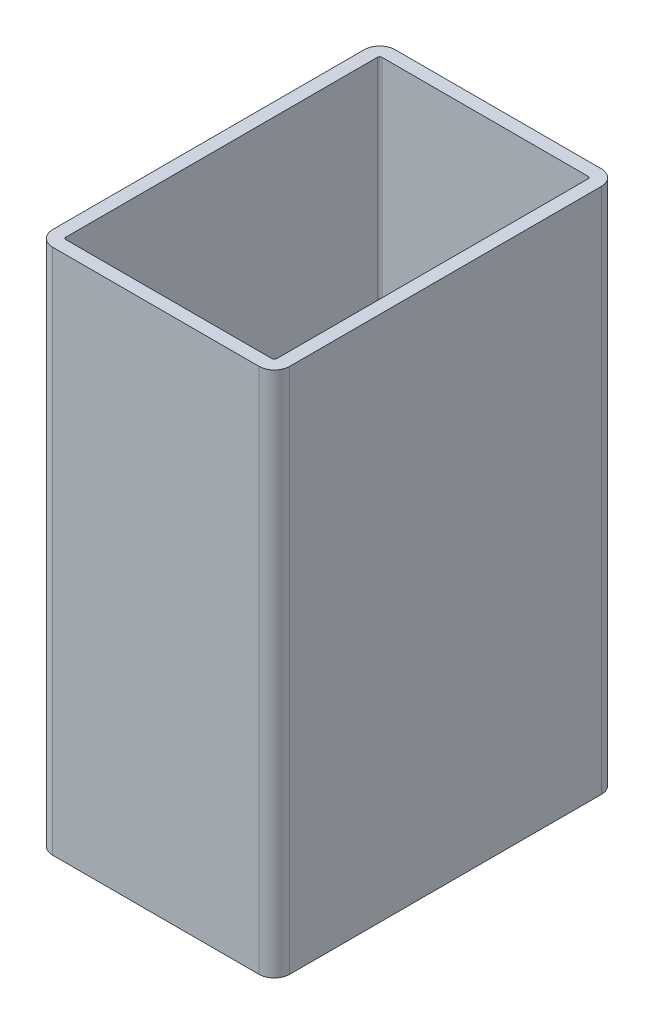
ISO-10303-21;
HEADER;
FILE_DESCRIPTION(('STEP AP214'),'2;1');
FILE_NAME('part.step','',(''),(''),'','','');
FILE_SCHEMA(('AUTOMOTIVE_DESIGN { 1 0 10303 214 1 1 1 1 }'));
ENDSEC;
DATA;
#1=APPLICATION_CONTEXT('core data for automotive mechanical design processes');
#2=APPLICATION_PROTOCOL_DEFINITION('international standard','automotive_design',2000,#1);
#3=PRODUCT_CONTEXT('',#1,'mechanical');
#4=PRODUCT('Part','Part','',(#3));
#5=PRODUCT_RELATED_PRODUCT_CATEGORY('part','',(#4));
#6=PRODUCT_DEFINITION_FORMATION('','',#4);
#7=PRODUCT_DEFINITION_CONTEXT('part definition',#1,'design');
#8=PRODUCT_DEFINITION('design','',#6,#7);
#9=PRODUCT_DEFINITION_SHAPE('','',#8);
#10=(LENGTH_UNIT() NAMED_UNIT(*) SI_UNIT(.MILLI.,.METRE.));
#11=(NAMED_UNIT(*) PLANE_ANGLE_UNIT() SI_UNIT($,.RADIAN.));
#12=(NAMED_UNIT(*) SI_UNIT($,.STERADIAN.) SOLID_ANGLE_UNIT());
#13=UNCERTAINTY_MEASURE_WITH_UNIT(LENGTH_MEASURE(1.E-05),#10,'distance_accuracy_value','');
#14=(GEOMETRIC_REPRESENTATION_CONTEXT(3) GLOBAL_UNCERTAINTY_ASSIGNED_CONTEXT((#13)) GLOBAL_UNIT_ASSIGNED_CONTEXT((#10,
#11,#12)) REPRESENTATION_CONTEXT('',''));
#15=CARTESIAN_POINT('',(0.,0.,0.));
#16=DIRECTION('',(0.,0.,1.));
#17=DIRECTION('',(1.,0.,0.));
#18=AXIS2_PLACEMENT_3D('',#15,#16,#17);
#19=CARTESIAN_POINT('',(-78.3333333333334,400.,118.333333333333));
#20=DIRECTION('',(0.,-1.,0.));
#21=DIRECTION('',(0.,0.,-1.));
#22=AXIS2_PLACEMENT_3D('',#19,#20,#21);
#23=CYLINDRICAL_SURFACE('',#22,11.6666666666667);
#24=CARTESIAN_POINT('',(-78.3333333333334,0.,118.333333333333));
#25=DIRECTION('',(0.,1.,0.));
#26=DIRECTION('',(0.,0.,1.));
#27=AXIS2_PLACEMENT_3D('',#24,#25,#26);
#28=CIRCLE('',#27,11.6666666666667);
#29=CARTESIAN_POINT('',(-90.,0.,118.333333333333));
#30=VERTEX_POINT('',#29);
#31=CARTESIAN_POINT('',(-78.3333333333333,0.,130.));
#32=VERTEX_POINT('',#31);
#33=EDGE_CURVE('E237',#30,#32,#28,.T.);
#34=ORIENTED_EDGE('',*,*,#33,.T.);
#35=DIRECTION('',(0.,-1.,0.));
#36=VECTOR('',#35,1.);
#37=CARTESIAN_POINT('',(-78.3333333333333,400.,130.));
#38=LINE('',#37,#36);
#39=CARTESIAN_POINT('',(-78.3333333333333,400.,130.));
#40=VERTEX_POINT('',#39);
#41=EDGE_CURVE('E12',#40,#32,#38,.T.);
#42=ORIENTED_EDGE('',*,*,#41,.F.);
#43=CARTESIAN_POINT('',(-78.3333333333334,400.,118.333333333333));
#44=DIRECTION('',(0.,1.,0.));
#45=DIRECTION('',(0.,0.,1.));
#46=AXIS2_PLACEMENT_3D('',#43,#44,#45);
#47=CIRCLE('',#46,11.6666666666667);
#48=CARTESIAN_POINT('',(-90.,400.,118.333333333333));
#49=VERTEX_POINT('',#48);
#50=EDGE_CURVE('E315',#49,#40,#47,.T.);
#51=ORIENTED_EDGE('',*,*,#50,.F.);
#52=DIRECTION('',(0.,-1.,0.));
#53=VECTOR('',#52,1.);
#54=CARTESIAN_POINT('',(-90.,400.,118.333333333333));
#55=LINE('',#54,#53);
#56=EDGE_CURVE('E252',#49,#30,#55,.T.);
#57=ORIENTED_EDGE('',*,*,#56,.T.);
#58=EDGE_LOOP('',(#34,#42,#51,#57));
#59=FACE_BOUND('',#58,.T.);
#60=ADVANCED_FACE('F65',(#59),#23,.T.);
#61=CARTESIAN_POINT('',(-78.3333333333333,400.,130.));
#62=DIRECTION('',(0.,0.,-1.));
#63=DIRECTION('',(-1.,0.,0.));
#64=AXIS2_PLACEMENT_3D('',#61,#62,#63);
#65=PLANE('',#64);
#66=DIRECTION('',(1.,0.,0.));
#67=VECTOR('',#66,1.);
#68=CARTESIAN_POINT('',(-78.3333333333333,0.,130.));
#69=LINE('',#68,#67);
#70=CARTESIAN_POINT('',(78.3333333333333,0.,130.));
#71=VERTEX_POINT('',#70);
#72=EDGE_CURVE('E240',#32,#71,#69,.T.);
#73=ORIENTED_EDGE('',*,*,#72,.T.);
#74=DIRECTION('',(0.,-1.,0.));
#75=VECTOR('',#74,1.);
#76=CARTESIAN_POINT('',(78.3333333333333,400.,130.));
#77=LINE('',#76,#75);
#78=CARTESIAN_POINT('',(78.3333333333333,400.,130.));
#79=VERTEX_POINT('',#78);
#80=EDGE_CURVE('E75',#79,#71,#77,.T.);
#81=ORIENTED_EDGE('',*,*,#80,.F.);
#82=DIRECTION('',(1.,0.,0.));
#83=VECTOR('',#82,1.);
#84=CARTESIAN_POINT('',(-78.3333333333333,400.,130.));
#85=LINE('',#84,#83);
#86=EDGE_CURVE('E317',#40,#79,#85,.T.);
#87=ORIENTED_EDGE('',*,*,#86,.F.);
#88=ORIENTED_EDGE('',*,*,#41,.T.);
#89=EDGE_LOOP('',(#73,#81,#87,#88));
#90=FACE_BOUND('',#89,.T.);
#91=ADVANCED_FACE('F352',(#90),#65,.F.);
#92=CARTESIAN_POINT('',(78.3333333333334,400.,118.333333333333));
#93=DIRECTION('',(0.,-1.,0.));
#94=DIRECTION('',(0.,0.,-1.));
#95=AXIS2_PLACEMENT_3D('',#92,#93,#94);
#96=CYLINDRICAL_SURFACE('',#95,11.6666666666667);
#97=CARTESIAN_POINT('',(78.3333333333334,0.,118.333333333333));
#98=DIRECTION('',(0.,1.,0.));
#99=DIRECTION('',(0.,0.,1.));
#100=AXIS2_PLACEMENT_3D('',#97,#98,#99);
#101=CIRCLE('',#100,11.6666666666667);
#102=CARTESIAN_POINT('',(90.,0.,118.333333333333));
#103=VERTEX_POINT('',#102);
#104=EDGE_CURVE('E242',#71,#103,#101,.T.);
#105=ORIENTED_EDGE('',*,*,#104,.T.);
#106=DIRECTION('',(0.,-1.,0.));
#107=VECTOR('',#106,1.);
#108=CARTESIAN_POINT('',(90.,400.,118.333333333333));
#109=LINE('',#108,#107);
#110=CARTESIAN_POINT('',(90.,400.,118.333333333333));
#111=VERTEX_POINT('',#110);
#112=EDGE_CURVE('E259',#111,#103,#109,.T.);
#113=ORIENTED_EDGE('',*,*,#112,.F.);
#114=CARTESIAN_POINT('',(78.3333333333334,400.,118.333333333333));
#115=DIRECTION('',(0.,1.,0.));
#116=DIRECTION('',(0.,0.,1.));
#117=AXIS2_PLACEMENT_3D('',#114,#115,#116);
#118=CIRCLE('',#117,11.6666666666667);
#119=EDGE_CURVE('E319',#79,#111,#118,.T.);
#120=ORIENTED_EDGE('',*,*,#119,.F.);
#121=ORIENTED_EDGE('',*,*,#80,.T.);
#122=EDGE_LOOP('',(#105,#113,#120,#121));
#123=FACE_BOUND('',#122,.T.);
#124=ADVANCED_FACE('F357',(#123),#96,.T.);
#125=CARTESIAN_POINT('',(90.,400.,-118.333333333333));
#126=DIRECTION('',(-1.,0.,0.));
#127=DIRECTION('',(0.,0.,1.));
#128=AXIS2_PLACEMENT_3D('',#125,#126,#127);
#129=PLANE('',#128);
#130=DIRECTION('',(0.,0.,-1.));
#131=VECTOR('',#130,1.);
#132=CARTESIAN_POINT('',(90.,0.,-118.333333333333));
#133=LINE('',#132,#131);
#134=CARTESIAN_POINT('',(90.,0.,-118.333333333333));
#135=VERTEX_POINT('',#134);
#136=EDGE_CURVE('E244',#103,#135,#133,.T.);
#137=ORIENTED_EDGE('',*,*,#136,.T.);
#138=DIRECTION('',(0.,-1.,0.));
#139=VECTOR('',#138,1.);
#140=CARTESIAN_POINT('',(90.,400.,-118.333333333333));
#141=LINE('',#140,#139);
#142=CARTESIAN_POINT('',(90.,400.,-118.333333333333));
#143=VERTEX_POINT('',#142);
#144=EDGE_CURVE('E256',#143,#135,#141,.T.);
#145=ORIENTED_EDGE('',*,*,#144,.F.);
#146=DIRECTION('',(0.,0.,-1.));
#147=VECTOR('',#146,1.);
#148=CARTESIAN_POINT('',(90.,400.,-118.333333333333));
#149=LINE('',#148,#147);
#150=EDGE_CURVE('E321',#111,#143,#149,.T.);
#151=ORIENTED_EDGE('',*,*,#150,.F.);
#152=ORIENTED_EDGE('',*,*,#112,.T.);
#153=EDGE_LOOP('',(#137,#145,#151,#152));
#154=FACE_BOUND('',#153,.T.);
#155=ADVANCED_FACE('F327',(#154),#129,.F.);
#156=CARTESIAN_POINT('',(78.3333333333333,400.,-118.333333333333));
#157=DIRECTION('',(0.,-1.,0.));
#158=DIRECTION('',(0.,0.,-1.));
#159=AXIS2_PLACEMENT_3D('',#156,#157,#158);
#160=CYLINDRICAL_SURFACE('',#159,11.6666666666667);
#161=CARTESIAN_POINT('',(78.3333333333333,0.,-118.333333333333));
#162=DIRECTION('',(0.,1.,0.));
#163=DIRECTION('',(0.,0.,1.));
#164=AXIS2_PLACEMENT_3D('',#161,#162,#163);
#165=CIRCLE('',#164,11.6666666666667);
#166=CARTESIAN_POINT('',(78.3333333333333,0.,-130.));
#167=VERTEX_POINT('',#166);
#168=EDGE_CURVE('E246',#135,#167,#165,.T.);
#169=ORIENTED_EDGE('',*,*,#168,.T.);
#170=DIRECTION('',(0.,-1.,0.));
#171=VECTOR('',#170,1.);
#172=CARTESIAN_POINT('',(78.3333333333333,400.,-130.));
#173=LINE('',#172,#171);
#174=CARTESIAN_POINT('',(78.3333333333333,400.,-130.));
#175=VERTEX_POINT('',#174);
#176=EDGE_CURVE('E204',#175,#167,#173,.T.);
#177=ORIENTED_EDGE('',*,*,#176,.F.);
#178=CARTESIAN_POINT('',(78.3333333333333,400.,-118.333333333333));
#179=DIRECTION('',(0.,1.,0.));
#180=DIRECTION('',(0.,0.,1.));
#181=AXIS2_PLACEMENT_3D('',#178,#179,#180);
#182=CIRCLE('',#181,11.6666666666667);
#183=EDGE_CURVE('E195',#143,#175,#182,.T.);
#184=ORIENTED_EDGE('',*,*,#183,.F.);
#185=ORIENTED_EDGE('',*,*,#144,.T.);
#186=EDGE_LOOP('',(#169,#177,#184,#185));
#187=FACE_BOUND('',#186,.T.);
#188=ADVANCED_FACE('F331',(#187),#160,.T.);
#189=CARTESIAN_POINT('',(78.3333333333333,400.,-130.));
#190=DIRECTION('',(0.,0.,1.));
#191=DIRECTION('',(1.,0.,0.));
#192=AXIS2_PLACEMENT_3D('',#189,#190,#191);
#193=PLANE('',#192);
#194=DIRECTION('',(-1.,0.,0.));
#195=VECTOR('',#194,1.);
#196=CARTESIAN_POINT('',(78.3333333333333,0.,-130.));
#197=LINE('',#196,#195);
#198=CARTESIAN_POINT('',(-78.3333333333333,0.,-130.));
#199=VERTEX_POINT('',#198);
#200=EDGE_CURVE('E203',#167,#199,#197,.T.);
#201=ORIENTED_EDGE('',*,*,#200,.T.);
#202=DIRECTION('',(0.,-1.,0.));
#203=VECTOR('',#202,1.);
#204=CARTESIAN_POINT('',(-78.3333333333333,400.,-130.));
#205=LINE('',#204,#203);
#206=CARTESIAN_POINT('',(-78.3333333333333,400.,-130.));
#207=VERTEX_POINT('',#206);
#208=EDGE_CURVE('E200',#207,#199,#205,.T.);
#209=ORIENTED_EDGE('',*,*,#208,.F.);
#210=DIRECTION('',(-1.,0.,0.));
#211=VECTOR('',#210,1.);
#212=CARTESIAN_POINT('',(78.3333333333333,400.,-130.));
#213=LINE('',#212,#211);
#214=EDGE_CURVE('E189',#175,#207,#213,.T.);
#215=ORIENTED_EDGE('',*,*,#214,.F.);
#216=ORIENTED_EDGE('',*,*,#176,.T.);
#217=EDGE_LOOP('',(#201,#209,#215,#216));
#218=FACE_BOUND('',#217,.T.);
#219=ADVANCED_FACE('F201',(#218),#193,.F.);
#220=CARTESIAN_POINT('',(-78.3333333333334,400.,-118.333333333333));
#221=DIRECTION('',(0.,-1.,0.));
#222=DIRECTION('',(0.,0.,-1.));
#223=AXIS2_PLACEMENT_3D('',#220,#221,#222);
#224=CYLINDRICAL_SURFACE('',#223,11.6666666666667);
#225=CARTESIAN_POINT('',(-78.3333333333334,0.,-118.333333333333));
#226=DIRECTION('',(0.,1.,0.));
#227=DIRECTION('',(0.,0.,1.));
#228=AXIS2_PLACEMENT_3D('',#225,#226,#227);
#229=CIRCLE('',#228,11.6666666666667);
#230=CARTESIAN_POINT('',(-90.,0.,-118.333333333333));
#231=VERTEX_POINT('',#230);
#232=EDGE_CURVE('E137',#199,#231,#229,.T.);
#233=ORIENTED_EDGE('',*,*,#232,.T.);
#234=DIRECTION('',(0.,-1.,0.));
#235=VECTOR('',#234,1.);
#236=CARTESIAN_POINT('',(-90.,400.,-118.333333333333));
#237=LINE('',#236,#235);
#238=CARTESIAN_POINT('',(-90.,400.,-118.333333333333));
#239=VERTEX_POINT('',#238);
#240=EDGE_CURVE('E205',#239,#231,#237,.T.);
#241=ORIENTED_EDGE('',*,*,#240,.F.);
#242=CARTESIAN_POINT('',(-78.3333333333334,400.,-118.333333333333));
#243=DIRECTION('',(0.,1.,0.));
#244=DIRECTION('',(0.,0.,1.));
#245=AXIS2_PLACEMENT_3D('',#242,#243,#244);
#246=CIRCLE('',#245,11.6666666666667);
#247=EDGE_CURVE('E193',#207,#239,#246,.T.);
#248=ORIENTED_EDGE('',*,*,#247,.F.);
#249=ORIENTED_EDGE('',*,*,#208,.T.);
#250=EDGE_LOOP('',(#233,#241,#248,#249));
#251=FACE_BOUND('',#250,.T.);
#252=ADVANCED_FACE('F207',(#251),#224,.T.);
#253=CARTESIAN_POINT('',(78.3333333333334,400.,118.333333333333));
#254=DIRECTION('',(0.,-1.,0.));
#255=DIRECTION('',(0.,0.,-1.));
#256=AXIS2_PLACEMENT_3D('',#253,#254,#255);
#257=CYLINDRICAL_SURFACE('',#256,1.66666666666671);
#258=CARTESIAN_POINT('',(78.3333333333334,0.,118.333333333333));
#259=DIRECTION('',(0.,1.,0.));
#260=DIRECTION('',(0.,0.,1.));
#261=AXIS2_PLACEMENT_3D('',#258,#259,#260);
#262=CIRCLE('',#261,1.66666666666671);
#263=CARTESIAN_POINT('',(78.3333333333333,0.,120.));
#264=VERTEX_POINT('',#263);
#265=CARTESIAN_POINT('',(80.,0.,118.333333333333));
#266=VERTEX_POINT('',#265);
#267=EDGE_CURVE('E213',#264,#266,#262,.T.);
#268=ORIENTED_EDGE('',*,*,#267,.F.);
#269=DIRECTION('',(0.,-1.,0.));
#270=VECTOR('',#269,1.);
#271=CARTESIAN_POINT('',(78.3333333333333,400.,120.));
#272=LINE('',#271,#270);
#273=CARTESIAN_POINT('',(78.3333333333333,400.,120.));
#274=VERTEX_POINT('',#273);
#275=EDGE_CURVE('E69',#274,#264,#272,.T.);
#276=ORIENTED_EDGE('',*,*,#275,.F.);
#277=CARTESIAN_POINT('',(78.3333333333334,400.,118.333333333333));
#278=DIRECTION('',(0.,1.,0.));
#279=DIRECTION('',(0.,0.,1.));
#280=AXIS2_PLACEMENT_3D('',#277,#278,#279);
#281=CIRCLE('',#280,1.66666666666671);
#282=CARTESIAN_POINT('',(80.,400.,118.333333333333));
#283=VERTEX_POINT('',#282);
#284=EDGE_CURVE('E251',#274,#283,#281,.T.);
#285=ORIENTED_EDGE('',*,*,#284,.T.);
#286=DIRECTION('',(0.,-1.,0.));
#287=VECTOR('',#286,1.);
#288=CARTESIAN_POINT('',(80.,400.,118.333333333333));
#289=LINE('',#288,#287);
#290=EDGE_CURVE('E209',#283,#266,#289,.T.);
#291=ORIENTED_EDGE('',*,*,#290,.T.);
#292=EDGE_LOOP('',(#268,#276,#285,#291));
#293=FACE_BOUND('',#292,.T.);
#294=ADVANCED_FACE('F67',(#293),#257,.F.);
#295=CARTESIAN_POINT('',(-78.3333333333333,400.,120.));
#296=DIRECTION('',(0.,0.,-1.));
#297=DIRECTION('',(-1.,0.,0.));
#298=AXIS2_PLACEMENT_3D('',#295,#296,#297);
#299=PLANE('',#298);
#300=DIRECTION('',(1.,0.,0.));
#301=VECTOR('',#300,1.);
#302=CARTESIAN_POINT('',(-78.3333333333333,0.,120.));
#303=LINE('',#302,#301);
#304=CARTESIAN_POINT('',(-78.3333333333333,0.,120.));
#305=VERTEX_POINT('',#304);
#306=EDGE_CURVE('E216',#305,#264,#303,.T.);
#307=ORIENTED_EDGE('',*,*,#306,.F.);
#308=DIRECTION('',(0.,-1.,0.));
#309=VECTOR('',#308,1.);
#310=CARTESIAN_POINT('',(-78.3333333333333,400.,120.));
#311=LINE('',#310,#309);
#312=CARTESIAN_POINT('',(-78.3333333333333,400.,120.));
#313=VERTEX_POINT('',#312);
#314=EDGE_CURVE('E274',#313,#305,#311,.T.);
#315=ORIENTED_EDGE('',*,*,#314,.F.);
#316=DIRECTION('',(1.,0.,0.));
#317=VECTOR('',#316,1.);
#318=CARTESIAN_POINT('',(-78.3333333333333,400.,120.));
#319=LINE('',#318,#317);
#320=EDGE_CURVE('E283',#313,#274,#319,.T.);
#321=ORIENTED_EDGE('',*,*,#320,.T.);
#322=ORIENTED_EDGE('',*,*,#275,.T.);
#323=EDGE_LOOP('',(#307,#315,#321,#322));
#324=FACE_BOUND('',#323,.T.);
#325=ADVANCED_FACE('F281',(#324),#299,.T.);
#326=CARTESIAN_POINT('',(-78.3333333333334,400.,118.333333333333));
#327=DIRECTION('',(0.,-1.,0.));
#328=DIRECTION('',(0.,0.,-1.));
#329=AXIS2_PLACEMENT_3D('',#326,#327,#328);
#330=CYLINDRICAL_SURFACE('',#329,1.66666666666671);
#331=CARTESIAN_POINT('',(-78.3333333333334,0.,118.333333333333));
#332=DIRECTION('',(0.,1.,0.));
#333=DIRECTION('',(0.,0.,1.));
#334=AXIS2_PLACEMENT_3D('',#331,#332,#333);
#335=CIRCLE('',#334,1.66666666666671);
#336=CARTESIAN_POINT('',(-80.0000000000001,0.,118.333333333333));
#337=VERTEX_POINT('',#336);
#338=EDGE_CURVE('E219',#337,#305,#335,.T.);
#339=ORIENTED_EDGE('',*,*,#338,.F.);
#340=DIRECTION('',(0.,-1.,0.));
#341=VECTOR('',#340,1.);
#342=CARTESIAN_POINT('',(-80.0000000000001,400.,118.333333333333));
#343=LINE('',#342,#341);
#344=CARTESIAN_POINT('',(-80.0000000000001,400.,118.333333333333));
#345=VERTEX_POINT('',#344);
#346=EDGE_CURVE('E273',#345,#337,#343,.T.);
#347=ORIENTED_EDGE('',*,*,#346,.F.);
#348=CARTESIAN_POINT('',(-78.3333333333334,400.,118.333333333333));
#349=DIRECTION('',(0.,1.,0.));
#350=DIRECTION('',(0.,0.,1.));
#351=AXIS2_PLACEMENT_3D('',#348,#349,#350);
#352=CIRCLE('',#351,1.66666666666671);
#353=EDGE_CURVE('E291',#345,#313,#352,.T.);
#354=ORIENTED_EDGE('',*,*,#353,.T.);
#355=ORIENTED_EDGE('',*,*,#314,.T.);
#356=EDGE_LOOP('',(#339,#347,#354,#355));
#357=FACE_BOUND('',#356,.T.);
#358=ADVANCED_FACE('F289',(#357),#330,.F.);
#359=CARTESIAN_POINT('',(-80.,400.,118.333333333333));
#360=DIRECTION('',(1.,0.,0.));
#361=DIRECTION('',(0.,0.,-1.));
#362=AXIS2_PLACEMENT_3D('',#359,#360,#361);
#363=PLANE('',#362);
#364=DIRECTION('',(0.,0.,1.));
#365=VECTOR('',#364,1.);
#366=CARTESIAN_POINT('',(-80.,0.,118.333333333333));
#367=LINE('',#366,#365);
#368=CARTESIAN_POINT('',(-80.,0.,-118.333333333333));
#369=VERTEX_POINT('',#368);
#370=EDGE_CURVE('E222',#369,#337,#367,.T.);
#371=ORIENTED_EDGE('',*,*,#370,.F.);
#372=DIRECTION('',(0.,-1.,0.));
#373=VECTOR('',#372,1.);
#374=CARTESIAN_POINT('',(-80.,400.,-118.333333333333));
#375=LINE('',#374,#373);
#376=CARTESIAN_POINT('',(-80.,400.,-118.333333333333));
#377=VERTEX_POINT('',#376);
#378=EDGE_CURVE('E271',#377,#369,#375,.T.);
#379=ORIENTED_EDGE('',*,*,#378,.F.);
#380=DIRECTION('',(0.,0.,1.));
#381=VECTOR('',#380,1.);
#382=CARTESIAN_POINT('',(-80.,400.,118.333333333333));
#383=LINE('',#382,#381);
#384=EDGE_CURVE('E297',#377,#345,#383,.T.);
#385=ORIENTED_EDGE('',*,*,#384,.T.);
#386=ORIENTED_EDGE('',*,*,#346,.T.);
#387=EDGE_LOOP('',(#371,#379,#385,#386));
#388=FACE_BOUND('',#387,.T.);
#389=ADVANCED_FACE('F300',(#388),#363,.T.);
#390=CARTESIAN_POINT('',(-78.3333333333334,400.,-118.333333333333));
#391=DIRECTION('',(0.,-1.,0.));
#392=DIRECTION('',(0.,0.,-1.));
#393=AXIS2_PLACEMENT_3D('',#390,#391,#392);
#394=CYLINDRICAL_SURFACE('',#393,1.66666666666671);
#395=CARTESIAN_POINT('',(-78.3333333333334,0.,-118.333333333333));
#396=DIRECTION('',(0.,1.,0.));
#397=DIRECTION('',(0.,0.,1.));
#398=AXIS2_PLACEMENT_3D('',#395,#396,#397);
#399=CIRCLE('',#398,1.66666666666671);
#400=CARTESIAN_POINT('',(-78.3333333333333,0.,-120.));
#401=VERTEX_POINT('',#400);
#402=EDGE_CURVE('E225',#401,#369,#399,.T.);
#403=ORIENTED_EDGE('',*,*,#402,.F.);
#404=DIRECTION('',(0.,-1.,0.));
#405=VECTOR('',#404,1.);
#406=CARTESIAN_POINT('',(-78.3333333333333,400.,-120.));
#407=LINE('',#406,#405);
#408=CARTESIAN_POINT('',(-78.3333333333333,400.,-120.));
#409=VERTEX_POINT('',#408);
#410=EDGE_CURVE('E269',#409,#401,#407,.T.);
#411=ORIENTED_EDGE('',*,*,#410,.F.);
#412=CARTESIAN_POINT('',(-78.3333333333334,400.,-118.333333333333));
#413=DIRECTION('',(0.,1.,0.));
#414=DIRECTION('',(0.,0.,1.));
#415=AXIS2_PLACEMENT_3D('',#412,#413,#414);
#416=CIRCLE('',#415,1.66666666666671);
#417=EDGE_CURVE('E301',#409,#377,#416,.T.);
#418=ORIENTED_EDGE('',*,*,#417,.T.);
#419=ORIENTED_EDGE('',*,*,#378,.T.);
#420=EDGE_LOOP('',(#403,#411,#418,#419));
#421=FACE_BOUND('',#420,.T.);
#422=ADVANCED_FACE('F368',(#421),#394,.F.);
#423=CARTESIAN_POINT('',(78.3333333333333,400.,-120.));
#424=DIRECTION('',(0.,0.,1.));
#425=DIRECTION('',(1.,0.,0.));
#426=AXIS2_PLACEMENT_3D('',#423,#424,#425);
#427=PLANE('',#426);
#428=DIRECTION('',(-1.,0.,0.));
#429=VECTOR('',#428,1.);
#430=CARTESIAN_POINT('',(78.3333333333333,0.,-120.));
#431=LINE('',#430,#429);
#432=CARTESIAN_POINT('',(78.3333333333333,0.,-120.));
#433=VERTEX_POINT('',#432);
#434=EDGE_CURVE('E228',#433,#401,#431,.T.);
#435=ORIENTED_EDGE('',*,*,#434,.F.);
#436=DIRECTION('',(0.,-1.,0.));
#437=VECTOR('',#436,1.);
#438=CARTESIAN_POINT('',(78.3333333333333,400.,-120.));
#439=LINE('',#438,#437);
#440=CARTESIAN_POINT('',(78.3333333333333,400.,-120.));
#441=VERTEX_POINT('',#440);
#442=EDGE_CURVE('E267',#441,#433,#439,.T.);
#443=ORIENTED_EDGE('',*,*,#442,.F.);
#444=DIRECTION('',(-1.,0.,0.));
#445=VECTOR('',#444,1.);
#446=CARTESIAN_POINT('',(78.3333333333333,400.,-120.));
#447=LINE('',#446,#445);
#448=EDGE_CURVE('E303',#441,#409,#447,.T.);
#449=ORIENTED_EDGE('',*,*,#448,.T.);
#450=ORIENTED_EDGE('',*,*,#410,.T.);
#451=EDGE_LOOP('',(#435,#443,#449,#450));
#452=FACE_BOUND('',#451,.T.);
#453=ADVANCED_FACE('F364',(#452),#427,.T.);
#454=CARTESIAN_POINT('',(78.3333333333333,400.,-118.333333333333));
#455=DIRECTION('',(0.,-1.,0.));
#456=DIRECTION('',(0.,0.,-1.));
#457=AXIS2_PLACEMENT_3D('',#454,#455,#456);
#458=CYLINDRICAL_SURFACE('',#457,1.66666666666669);
#459=CARTESIAN_POINT('',(78.3333333333333,0.,-118.333333333333));
#460=DIRECTION('',(0.,1.,0.));
#461=DIRECTION('',(0.,0.,1.));
#462=AXIS2_PLACEMENT_3D('',#459,#460,#461);
#463=CIRCLE('',#462,1.66666666666669);
#464=CARTESIAN_POINT('',(80.,0.,-118.333333333333));
#465=VERTEX_POINT('',#464);
#466=EDGE_CURVE('E231',#465,#433,#463,.T.);
#467=ORIENTED_EDGE('',*,*,#466,.F.);
#468=DIRECTION('',(0.,-1.,0.));
#469=VECTOR('',#468,1.);
#470=CARTESIAN_POINT('',(80.,400.,-118.333333333333));
#471=LINE('',#470,#469);
#472=CARTESIAN_POINT('',(80.,400.,-118.333333333333));
#473=VERTEX_POINT('',#472);
#474=EDGE_CURVE('E265',#473,#465,#471,.T.);
#475=ORIENTED_EDGE('',*,*,#474,.F.);
#476=CARTESIAN_POINT('',(78.3333333333333,400.,-118.333333333333));
#477=DIRECTION('',(0.,1.,0.));
#478=DIRECTION('',(0.,0.,1.));
#479=AXIS2_PLACEMENT_3D('',#476,#477,#478);
#480=CIRCLE('',#479,1.66666666666669);
#481=EDGE_CURVE('E309',#473,#441,#480,.T.);
#482=ORIENTED_EDGE('',*,*,#481,.T.);
#483=ORIENTED_EDGE('',*,*,#442,.T.);
#484=EDGE_LOOP('',(#467,#475,#482,#483));
#485=FACE_BOUND('',#484,.T.);
#486=ADVANCED_FACE('F346',(#485),#458,.F.);
#487=CARTESIAN_POINT('',(80.,400.,-118.333333333333));
#488=DIRECTION('',(-1.,0.,0.));
#489=DIRECTION('',(0.,0.,1.));
#490=AXIS2_PLACEMENT_3D('',#487,#488,#489);
#491=PLANE('',#490);
#492=DIRECTION('',(0.,0.,-1.));
#493=VECTOR('',#492,1.);
#494=CARTESIAN_POINT('',(80.,0.,-118.333333333333));
#495=LINE('',#494,#493);
#496=EDGE_CURVE('E234',#266,#465,#495,.T.);
#497=ORIENTED_EDGE('',*,*,#496,.F.);
#498=ORIENTED_EDGE('',*,*,#290,.F.);
#499=DIRECTION('',(0.,0.,-1.));
#500=VECTOR('',#499,1.);
#501=CARTESIAN_POINT('',(80.,400.,-118.333333333333));
#502=LINE('',#501,#500);
#503=EDGE_CURVE('E312',#283,#473,#502,.T.);
#504=ORIENTED_EDGE('',*,*,#503,.T.);
#505=ORIENTED_EDGE('',*,*,#474,.T.);
#506=EDGE_LOOP('',(#497,#498,#504,#505));
#507=FACE_BOUND('',#506,.T.);
#508=ADVANCED_FACE('F339',(#507),#491,.T.);
#509=CARTESIAN_POINT('',(-90.,400.,118.333333333333));
#510=DIRECTION('',(1.,0.,0.));
#511=DIRECTION('',(0.,0.,-1.));
#512=AXIS2_PLACEMENT_3D('',#509,#510,#511);
#513=PLANE('',#512);
#514=DIRECTION('',(0.,0.,1.));
#515=VECTOR('',#514,1.);
#516=CARTESIAN_POINT('',(-90.,0.,118.333333333333));
#517=LINE('',#516,#515);
#518=EDGE_CURVE('E143',#231,#30,#517,.T.);
#519=ORIENTED_EDGE('',*,*,#518,.T.);
#520=ORIENTED_EDGE('',*,*,#56,.F.);
#521=DIRECTION('',(0.,0.,1.));
#522=VECTOR('',#521,1.);
#523=CARTESIAN_POINT('',(-90.,400.,118.333333333333));
#524=LINE('',#523,#522);
#525=EDGE_CURVE('E84',#239,#49,#524,.T.);
#526=ORIENTED_EDGE('',*,*,#525,.F.);
#527=ORIENTED_EDGE('',*,*,#240,.T.);
#528=EDGE_LOOP('',(#519,#520,#526,#527));
#529=FACE_BOUND('',#528,.T.);
#530=ADVANCED_FACE('F337',(#529),#513,.F.);
#531=CARTESIAN_POINT('',(-78.3333333333334,400.,118.333333333333));
#532=DIRECTION('',(0.,1.,0.));
#533=DIRECTION('',(0.,0.,1.));
#534=AXIS2_PLACEMENT_3D('',#531,#532,#533);
#535=PLANE('',#534);
#536=ORIENTED_EDGE('',*,*,#284,.F.);
#537=ORIENTED_EDGE('',*,*,#320,.F.);
#538=ORIENTED_EDGE('',*,*,#353,.F.);
#539=ORIENTED_EDGE('',*,*,#384,.F.);
#540=ORIENTED_EDGE('',*,*,#417,.F.);
#541=ORIENTED_EDGE('',*,*,#448,.F.);
#542=ORIENTED_EDGE('',*,*,#481,.F.);
#543=ORIENTED_EDGE('',*,*,#503,.F.);
#544=EDGE_LOOP('',(#536,#537,#538,#539,#540,#541,#542,#543));
#545=FACE_BOUND('',#544,.T.);
#546=ORIENTED_EDGE('',*,*,#50,.T.);
#547=ORIENTED_EDGE('',*,*,#86,.T.);
#548=ORIENTED_EDGE('',*,*,#119,.T.);
#549=ORIENTED_EDGE('',*,*,#150,.T.);
#550=ORIENTED_EDGE('',*,*,#183,.T.);
#551=ORIENTED_EDGE('',*,*,#214,.T.);
#552=ORIENTED_EDGE('',*,*,#247,.T.);
#553=ORIENTED_EDGE('',*,*,#525,.T.);
#554=EDGE_LOOP('',(#546,#547,#548,#549,#550,#551,#552,#553));
#555=FACE_BOUND('',#554,.T.);
#556=ADVANCED_FACE('F191',(#545,#555),#535,.T.);
#557=CARTESIAN_POINT('',(-78.3333333333334,0.,118.333333333333));
#558=DIRECTION('',(0.,1.,0.));
#559=DIRECTION('',(0.,0.,1.));
#560=AXIS2_PLACEMENT_3D('',#557,#558,#559);
#561=PLANE('',#560);
#562=ORIENTED_EDGE('',*,*,#267,.T.);
#563=ORIENTED_EDGE('',*,*,#496,.T.);
#564=ORIENTED_EDGE('',*,*,#466,.T.);
#565=ORIENTED_EDGE('',*,*,#434,.T.);
#566=ORIENTED_EDGE('',*,*,#402,.T.);
#567=ORIENTED_EDGE('',*,*,#370,.T.);
#568=ORIENTED_EDGE('',*,*,#338,.T.);
#569=ORIENTED_EDGE('',*,*,#306,.T.);
#570=EDGE_LOOP('',(#562,#563,#564,#565,#566,#567,#568,#569));
#571=FACE_BOUND('',#570,.T.);
#572=ORIENTED_EDGE('',*,*,#33,.F.);
#573=ORIENTED_EDGE('',*,*,#518,.F.);
#574=ORIENTED_EDGE('',*,*,#232,.F.);
#575=ORIENTED_EDGE('',*,*,#200,.F.);
#576=ORIENTED_EDGE('',*,*,#168,.F.);
#577=ORIENTED_EDGE('',*,*,#136,.F.);
#578=ORIENTED_EDGE('',*,*,#104,.F.);
#579=ORIENTED_EDGE('',*,*,#72,.F.);
#580=EDGE_LOOP('',(#572,#573,#574,#575,#576,#577,#578,#579));
#581=FACE_BOUND('',#580,.T.);
#582=ADVANCED_FACE('F286',(#571,#581),#561,.F.);
#583=CLOSED_SHELL('',(#60,#91,#124,#155,#188,#219,#252,#294,#325,#358,#389,#422,#453,#486,#508,
#530,#556,#582));
#584=MANIFOLD_SOLID_BREP('B2',#583);
#585=ADVANCED_BREP_SHAPE_REPRESENTATION('',(#18,#584),#14);
#586=SHAPE_DEFINITION_REPRESENTATION(#9,#585);
ENDSEC;
END-ISO-10303-21;
